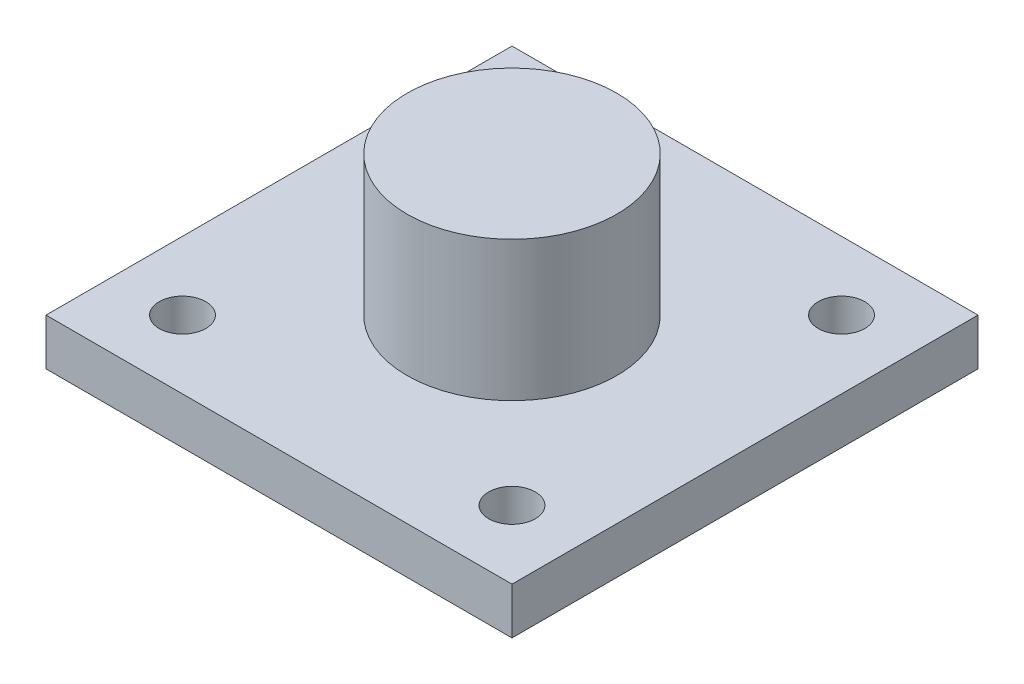
ISO-10303-21;
HEADER;
FILE_DESCRIPTION(('STEP AP214'),'2;1');
FILE_NAME('part.step','',(''),(''),'','','');
FILE_SCHEMA(('AUTOMOTIVE_DESIGN { 1 0 10303 214 1 1 1 1 }'));
ENDSEC;
DATA;
#1=APPLICATION_CONTEXT('core data for automotive mechanical design processes');
#2=APPLICATION_PROTOCOL_DEFINITION('international standard','automotive_design',2000,#1);
#3=PRODUCT_CONTEXT('',#1,'mechanical');
#4=PRODUCT('Part','Part','',(#3));
#5=PRODUCT_RELATED_PRODUCT_CATEGORY('part','',(#4));
#6=PRODUCT_DEFINITION_FORMATION('','',#4);
#7=PRODUCT_DEFINITION_CONTEXT('part definition',#1,'design');
#8=PRODUCT_DEFINITION('design','',#6,#7);
#9=PRODUCT_DEFINITION_SHAPE('','',#8);
#10=(LENGTH_UNIT() NAMED_UNIT(*) SI_UNIT(.MILLI.,.METRE.));
#11=(NAMED_UNIT(*) PLANE_ANGLE_UNIT() SI_UNIT($,.RADIAN.));
#12=(NAMED_UNIT(*) SI_UNIT($,.STERADIAN.) SOLID_ANGLE_UNIT());
#13=UNCERTAINTY_MEASURE_WITH_UNIT(LENGTH_MEASURE(1.E-05),#10,'distance_accuracy_value','');
#14=(GEOMETRIC_REPRESENTATION_CONTEXT(3) GLOBAL_UNCERTAINTY_ASSIGNED_CONTEXT((#13)) GLOBAL_UNIT_ASSIGNED_CONTEXT((#10,
#11,#12)) REPRESENTATION_CONTEXT('',''));
#15=CARTESIAN_POINT('',(0.,0.,0.));
#16=DIRECTION('',(0.,0.,1.));
#17=DIRECTION('',(1.,0.,0.));
#18=AXIS2_PLACEMENT_3D('',#15,#16,#17);
#19=CARTESIAN_POINT('',(0.,10.,0.));
#20=DIRECTION('',(0.,-1.,0.));
#21=DIRECTION('',(0.,0.,-1.));
#22=AXIS2_PLACEMENT_3D('',#19,#20,#21);
#23=PLANE('',#22);
#24=CARTESIAN_POINT('',(0.,10.,0.));
#25=DIRECTION('',(0.,1.,0.));
#26=DIRECTION('',(0.,0.,1.));
#27=AXIS2_PLACEMENT_3D('',#24,#25,#26);
#28=CIRCLE('',#27,22.5);
#29=CARTESIAN_POINT('',(0.,10.,22.5));
#30=VERTEX_POINT('',#29);
#31=EDGE_CURVE('E11',#30,#30,#28,.T.);
#32=ORIENTED_EDGE('',*,*,#31,.F.);
#33=EDGE_LOOP('',(#32));
#34=FACE_BOUND('',#33,.T.);
#35=DIRECTION('',(0.,0.,-1.));
#36=VECTOR('',#35,1.);
#37=CARTESIAN_POINT('',(50.,10.,50.));
#38=LINE('',#37,#36);
#39=CARTESIAN_POINT('',(50.,10.,50.));
#40=VERTEX_POINT('',#39);
#41=CARTESIAN_POINT('',(50.,10.,-50.));
#42=VERTEX_POINT('',#41);
#43=EDGE_CURVE('E96',#40,#42,#38,.T.);
#44=ORIENTED_EDGE('',*,*,#43,.T.);
#45=DIRECTION('',(-1.,0.,0.));
#46=VECTOR('',#45,1.);
#47=CARTESIAN_POINT('',(-50.,10.,-50.));
#48=LINE('',#47,#46);
#49=CARTESIAN_POINT('',(-50.,10.,-50.));
#50=VERTEX_POINT('',#49);
#51=EDGE_CURVE('E91',#42,#50,#48,.T.);
#52=ORIENTED_EDGE('',*,*,#51,.T.);
#53=DIRECTION('',(0.,0.,1.));
#54=VECTOR('',#53,1.);
#55=CARTESIAN_POINT('',(-50.,10.,50.));
#56=LINE('',#55,#54);
#57=CARTESIAN_POINT('',(-50.,10.,50.));
#58=VERTEX_POINT('',#57);
#59=EDGE_CURVE('E94',#50,#58,#56,.T.);
#60=ORIENTED_EDGE('',*,*,#59,.T.);
#61=DIRECTION('',(1.,0.,0.));
#62=VECTOR('',#61,1.);
#63=CARTESIAN_POINT('',(-50.,10.,50.));
#64=LINE('',#63,#62);
#65=EDGE_CURVE('E60',#58,#40,#64,.T.);
#66=ORIENTED_EDGE('',*,*,#65,.T.);
#67=EDGE_LOOP('',(#44,#52,#60,#66));
#68=FACE_BOUND('',#67,.T.);
#69=CARTESIAN_POINT('',(35.3553390593274,10.,-35.3553390593274));
#70=DIRECTION('',(0.,1.,0.));
#71=DIRECTION('',(0.,0.,1.));
#72=AXIS2_PLACEMENT_3D('',#69,#70,#71);
#73=CIRCLE('',#72,5.);
#74=CARTESIAN_POINT('',(35.3553390593274,10.,-30.3553390593274));
#75=VERTEX_POINT('',#74);
#76=EDGE_CURVE('E117',#75,#75,#73,.T.);
#77=ORIENTED_EDGE('',*,*,#76,.F.);
#78=EDGE_LOOP('',(#77));
#79=FACE_BOUND('',#78,.T.);
#80=CARTESIAN_POINT('',(-35.3553390593274,10.,-35.3553390593274));
#81=DIRECTION('',(0.,1.,0.));
#82=DIRECTION('',(0.,0.,-1.));
#83=AXIS2_PLACEMENT_3D('',#80,#81,#82);
#84=CIRCLE('',#83,5.);
#85=CARTESIAN_POINT('',(-35.3553390593274,10.,-40.3553390593274));
#86=VERTEX_POINT('',#85);
#87=EDGE_CURVE('E139',#86,#86,#84,.T.);
#88=ORIENTED_EDGE('',*,*,#87,.F.);
#89=EDGE_LOOP('',(#88));
#90=FACE_BOUND('',#89,.T.);
#91=CARTESIAN_POINT('',(-35.3553390593274,10.,35.3553390593273));
#92=DIRECTION('',(0.,1.,0.));
#93=DIRECTION('',(0.,0.,1.));
#94=AXIS2_PLACEMENT_3D('',#91,#92,#93);
#95=CIRCLE('',#94,5.);
#96=CARTESIAN_POINT('',(-35.3553390593274,10.,40.3553390593273));
#97=VERTEX_POINT('',#96);
#98=EDGE_CURVE('E147',#97,#97,#95,.T.);
#99=ORIENTED_EDGE('',*,*,#98,.F.);
#100=EDGE_LOOP('',(#99));
#101=FACE_BOUND('',#100,.T.);
#102=CARTESIAN_POINT('',(35.3553390593274,10.,35.3553390593274));
#103=DIRECTION('',(0.,1.,0.));
#104=DIRECTION('',(0.,0.,-1.));
#105=AXIS2_PLACEMENT_3D('',#102,#103,#104);
#106=CIRCLE('',#105,5.);
#107=CARTESIAN_POINT('',(35.3553390593274,10.,30.3553390593274));
#108=VERTEX_POINT('',#107);
#109=EDGE_CURVE('E155',#108,#108,#106,.T.);
#110=ORIENTED_EDGE('',*,*,#109,.F.);
#111=EDGE_LOOP('',(#110));
#112=FACE_BOUND('',#111,.T.);
#113=ADVANCED_FACE('F41',(#34,#68,#79,#90,#101,#112),#23,.F.);
#114=CARTESIAN_POINT('',(0.,0.,0.));
#115=DIRECTION('',(0.,-1.,0.));
#116=DIRECTION('',(0.,0.,-1.));
#117=AXIS2_PLACEMENT_3D('',#114,#115,#116);
#118=PLANE('',#117);
#119=CARTESIAN_POINT('',(-35.3553390593274,0.,35.3553390593273));
#120=DIRECTION('',(0.,1.,0.));
#121=DIRECTION('',(0.,0.,1.));
#122=AXIS2_PLACEMENT_3D('',#119,#120,#121);
#123=CIRCLE('',#122,5.);
#124=CARTESIAN_POINT('',(-35.3553390593274,0.,40.3553390593273));
#125=VERTEX_POINT('',#124);
#126=EDGE_CURVE('E151',#125,#125,#123,.T.);
#127=ORIENTED_EDGE('',*,*,#126,.T.);
#128=EDGE_LOOP('',(#127));
#129=FACE_BOUND('',#128,.T.);
#130=CARTESIAN_POINT('',(35.3553390593274,0.,-35.3553390593274));
#131=DIRECTION('',(0.,1.,0.));
#132=DIRECTION('',(0.,0.,1.));
#133=AXIS2_PLACEMENT_3D('',#130,#131,#132);
#134=CIRCLE('',#133,5.);
#135=CARTESIAN_POINT('',(35.3553390593274,0.,-30.3553390593274));
#136=VERTEX_POINT('',#135);
#137=EDGE_CURVE('E135',#136,#136,#134,.T.);
#138=ORIENTED_EDGE('',*,*,#137,.T.);
#139=EDGE_LOOP('',(#138));
#140=FACE_BOUND('',#139,.T.);
#141=DIRECTION('',(0.,0.,-1.));
#142=VECTOR('',#141,1.);
#143=CARTESIAN_POINT('',(50.,0.,50.));
#144=LINE('',#143,#142);
#145=CARTESIAN_POINT('',(50.,0.,50.));
#146=VERTEX_POINT('',#145);
#147=CARTESIAN_POINT('',(50.,0.,-50.));
#148=VERTEX_POINT('',#147);
#149=EDGE_CURVE('E113',#146,#148,#144,.T.);
#150=ORIENTED_EDGE('',*,*,#149,.F.);
#151=DIRECTION('',(1.,0.,0.));
#152=VECTOR('',#151,1.);
#153=CARTESIAN_POINT('',(-50.,0.,50.));
#154=LINE('',#153,#152);
#155=CARTESIAN_POINT('',(-50.,0.,50.));
#156=VERTEX_POINT('',#155);
#157=EDGE_CURVE('E83',#156,#146,#154,.T.);
#158=ORIENTED_EDGE('',*,*,#157,.F.);
#159=DIRECTION('',(0.,0.,1.));
#160=VECTOR('',#159,1.);
#161=CARTESIAN_POINT('',(-50.,0.,50.));
#162=LINE('',#161,#160);
#163=CARTESIAN_POINT('',(-50.,0.,-50.));
#164=VERTEX_POINT('',#163);
#165=EDGE_CURVE('E77',#164,#156,#162,.T.);
#166=ORIENTED_EDGE('',*,*,#165,.F.);
#167=DIRECTION('',(-1.,0.,0.));
#168=VECTOR('',#167,1.);
#169=CARTESIAN_POINT('',(-50.,0.,-50.));
#170=LINE('',#169,#168);
#171=EDGE_CURVE('E102',#148,#164,#170,.T.);
#172=ORIENTED_EDGE('',*,*,#171,.F.);
#173=EDGE_LOOP('',(#150,#158,#166,#172));
#174=FACE_BOUND('',#173,.T.);
#175=CARTESIAN_POINT('',(-35.3553390593274,0.,-35.3553390593274));
#176=DIRECTION('',(0.,1.,0.));
#177=DIRECTION('',(0.,0.,-1.));
#178=AXIS2_PLACEMENT_3D('',#175,#176,#177);
#179=CIRCLE('',#178,5.);
#180=CARTESIAN_POINT('',(-35.3553390593274,0.,-40.3553390593274));
#181=VERTEX_POINT('',#180);
#182=EDGE_CURVE('E143',#181,#181,#179,.T.);
#183=ORIENTED_EDGE('',*,*,#182,.T.);
#184=EDGE_LOOP('',(#183));
#185=FACE_BOUND('',#184,.T.);
#186=CARTESIAN_POINT('',(35.3553390593274,0.,35.3553390593274));
#187=DIRECTION('',(0.,1.,0.));
#188=DIRECTION('',(0.,0.,-1.));
#189=AXIS2_PLACEMENT_3D('',#186,#187,#188);
#190=CIRCLE('',#189,5.);
#191=CARTESIAN_POINT('',(35.3553390593274,0.,30.3553390593274));
#192=VERTEX_POINT('',#191);
#193=EDGE_CURVE('E159',#192,#192,#190,.T.);
#194=ORIENTED_EDGE('',*,*,#193,.T.);
#195=EDGE_LOOP('',(#194));
#196=FACE_BOUND('',#195,.T.);
#197=ADVANCED_FACE('F130',(#129,#140,#174,#185,#196),#118,.T.);
#198=CARTESIAN_POINT('',(50.,10.,50.));
#199=DIRECTION('',(-1.,0.,0.));
#200=DIRECTION('',(0.,0.,1.));
#201=AXIS2_PLACEMENT_3D('',#198,#199,#200);
#202=PLANE('',#201);
#203=ORIENTED_EDGE('',*,*,#149,.T.);
#204=DIRECTION('',(0.,-1.,0.));
#205=VECTOR('',#204,1.);
#206=CARTESIAN_POINT('',(50.,10.,-50.));
#207=LINE('',#206,#205);
#208=EDGE_CURVE('E45',#42,#148,#207,.T.);
#209=ORIENTED_EDGE('',*,*,#208,.F.);
#210=ORIENTED_EDGE('',*,*,#43,.F.);
#211=DIRECTION('',(0.,-1.,0.));
#212=VECTOR('',#211,1.);
#213=CARTESIAN_POINT('',(50.,10.,50.));
#214=LINE('',#213,#212);
#215=EDGE_CURVE('E109',#40,#146,#214,.T.);
#216=ORIENTED_EDGE('',*,*,#215,.T.);
#217=EDGE_LOOP('',(#203,#209,#210,#216));
#218=FACE_BOUND('',#217,.T.);
#219=ADVANCED_FACE('F43',(#218),#202,.F.);
#220=CARTESIAN_POINT('',(-50.,10.,-50.));
#221=DIRECTION('',(0.,0.,1.));
#222=DIRECTION('',(1.,0.,0.));
#223=AXIS2_PLACEMENT_3D('',#220,#221,#222);
#224=PLANE('',#223);
#225=ORIENTED_EDGE('',*,*,#171,.T.);
#226=DIRECTION('',(0.,-1.,0.));
#227=VECTOR('',#226,1.);
#228=CARTESIAN_POINT('',(-50.,10.,-50.));
#229=LINE('',#228,#227);
#230=EDGE_CURVE('E100',#50,#164,#229,.T.);
#231=ORIENTED_EDGE('',*,*,#230,.F.);
#232=ORIENTED_EDGE('',*,*,#51,.F.);
#233=ORIENTED_EDGE('',*,*,#208,.T.);
#234=EDGE_LOOP('',(#225,#231,#232,#233));
#235=FACE_BOUND('',#234,.T.);
#236=ADVANCED_FACE('F101',(#235),#224,.F.);
#237=CARTESIAN_POINT('',(-50.,10.,50.));
#238=DIRECTION('',(1.,0.,0.));
#239=DIRECTION('',(0.,0.,-1.));
#240=AXIS2_PLACEMENT_3D('',#237,#238,#239);
#241=PLANE('',#240);
#242=ORIENTED_EDGE('',*,*,#165,.T.);
#243=DIRECTION('',(0.,-1.,0.));
#244=VECTOR('',#243,1.);
#245=CARTESIAN_POINT('',(-50.,10.,50.));
#246=LINE('',#245,#244);
#247=EDGE_CURVE('E104',#58,#156,#246,.T.);
#248=ORIENTED_EDGE('',*,*,#247,.F.);
#249=ORIENTED_EDGE('',*,*,#59,.F.);
#250=ORIENTED_EDGE('',*,*,#230,.T.);
#251=EDGE_LOOP('',(#242,#248,#249,#250));
#252=FACE_BOUND('',#251,.T.);
#253=ADVANCED_FACE('F105',(#252),#241,.F.);
#254=CARTESIAN_POINT('',(-50.,10.,50.));
#255=DIRECTION('',(0.,0.,-1.));
#256=DIRECTION('',(-1.,0.,0.));
#257=AXIS2_PLACEMENT_3D('',#254,#255,#256);
#258=PLANE('',#257);
#259=ORIENTED_EDGE('',*,*,#157,.T.);
#260=ORIENTED_EDGE('',*,*,#215,.F.);
#261=ORIENTED_EDGE('',*,*,#65,.F.);
#262=ORIENTED_EDGE('',*,*,#247,.T.);
#263=EDGE_LOOP('',(#259,#260,#261,#262));
#264=FACE_BOUND('',#263,.T.);
#265=ADVANCED_FACE('F127',(#264),#258,.F.);
#266=CARTESIAN_POINT('',(35.3553390593274,10.,-35.3553390593274));
#267=DIRECTION('',(0.,-1.,0.));
#268=DIRECTION('',(0.,0.,-1.));
#269=AXIS2_PLACEMENT_3D('',#266,#267,#268);
#270=CYLINDRICAL_SURFACE('',#269,5.);
#271=ORIENTED_EDGE('',*,*,#76,.T.);
#272=EDGE_LOOP('',(#271));
#273=FACE_BOUND('',#272,.T.);
#274=ORIENTED_EDGE('',*,*,#137,.F.);
#275=EDGE_LOOP('',(#274));
#276=FACE_BOUND('',#275,.T.);
#277=ADVANCED_FACE('F188',(#273,#276),#270,.F.);
#278=CARTESIAN_POINT('',(-35.3553390593274,10.,-35.3553390593274));
#279=DIRECTION('',(0.,-1.,0.));
#280=DIRECTION('',(0.,0.,-1.));
#281=AXIS2_PLACEMENT_3D('',#278,#279,#280);
#282=CYLINDRICAL_SURFACE('',#281,5.);
#283=ORIENTED_EDGE('',*,*,#87,.T.);
#284=EDGE_LOOP('',(#283));
#285=FACE_BOUND('',#284,.T.);
#286=ORIENTED_EDGE('',*,*,#182,.F.);
#287=EDGE_LOOP('',(#286));
#288=FACE_BOUND('',#287,.T.);
#289=ADVANCED_FACE('F242',(#285,#288),#282,.F.);
#290=CARTESIAN_POINT('',(-35.3553390593274,10.,35.3553390593273));
#291=DIRECTION('',(0.,-1.,0.));
#292=DIRECTION('',(0.,0.,-1.));
#293=AXIS2_PLACEMENT_3D('',#290,#291,#292);
#294=CYLINDRICAL_SURFACE('',#293,5.);
#295=ORIENTED_EDGE('',*,*,#98,.T.);
#296=EDGE_LOOP('',(#295));
#297=FACE_BOUND('',#296,.T.);
#298=ORIENTED_EDGE('',*,*,#126,.F.);
#299=EDGE_LOOP('',(#298));
#300=FACE_BOUND('',#299,.T.);
#301=ADVANCED_FACE('F234',(#297,#300),#294,.F.);
#302=CARTESIAN_POINT('',(35.3553390593274,10.,35.3553390593274));
#303=DIRECTION('',(0.,-1.,0.));
#304=DIRECTION('',(0.,0.,-1.));
#305=AXIS2_PLACEMENT_3D('',#302,#303,#304);
#306=CYLINDRICAL_SURFACE('',#305,5.);
#307=ORIENTED_EDGE('',*,*,#109,.T.);
#308=EDGE_LOOP('',(#307));
#309=FACE_BOUND('',#308,.T.);
#310=ORIENTED_EDGE('',*,*,#193,.F.);
#311=EDGE_LOOP('',(#310));
#312=FACE_BOUND('',#311,.T.);
#313=ADVANCED_FACE('F176',(#309,#312),#306,.F.);
#314=CARTESIAN_POINT('',(0.,40.,0.));
#315=DIRECTION('',(0.,-1.,0.));
#316=DIRECTION('',(0.,0.,-1.));
#317=AXIS2_PLACEMENT_3D('',#314,#315,#316);
#318=CYLINDRICAL_SURFACE('',#317,22.5);
#319=CARTESIAN_POINT('',(0.,40.,0.));
#320=DIRECTION('',(0.,1.,0.));
#321=DIRECTION('',(0.,0.,1.));
#322=AXIS2_PLACEMENT_3D('',#319,#320,#321);
#323=CIRCLE('',#322,22.5);
#324=CARTESIAN_POINT('',(0.,40.,22.5));
#325=VERTEX_POINT('',#324);
#326=EDGE_CURVE('E163',#325,#325,#323,.T.);
#327=ORIENTED_EDGE('',*,*,#326,.F.);
#328=EDGE_LOOP('',(#327));
#329=FACE_BOUND('',#328,.T.);
#330=ORIENTED_EDGE('',*,*,#31,.T.);
#331=EDGE_LOOP('',(#330));
#332=FACE_BOUND('',#331,.T.);
#333=ADVANCED_FACE('F173',(#329,#332),#318,.T.);
#334=CARTESIAN_POINT('',(0.,40.,0.));
#335=DIRECTION('',(0.,1.,0.));
#336=DIRECTION('',(0.,0.,1.));
#337=AXIS2_PLACEMENT_3D('',#334,#335,#336);
#338=PLANE('',#337);
#339=ORIENTED_EDGE('',*,*,#326,.T.);
#340=EDGE_LOOP('',(#339));
#341=FACE_BOUND('',#340,.T.);
#342=ADVANCED_FACE('F171',(#341),#338,.T.);
#343=CLOSED_SHELL('',(#113,#197,#219,#236,#253,#265,#277,#289,#301,#313,#333,#342));
#344=MANIFOLD_SOLID_BREP('B2',#343);
#345=ADVANCED_BREP_SHAPE_REPRESENTATION('',(#18,#344),#14);
#346=SHAPE_DEFINITION_REPRESENTATION(#9,#345);
ENDSEC;
END-ISO-10303-21;
